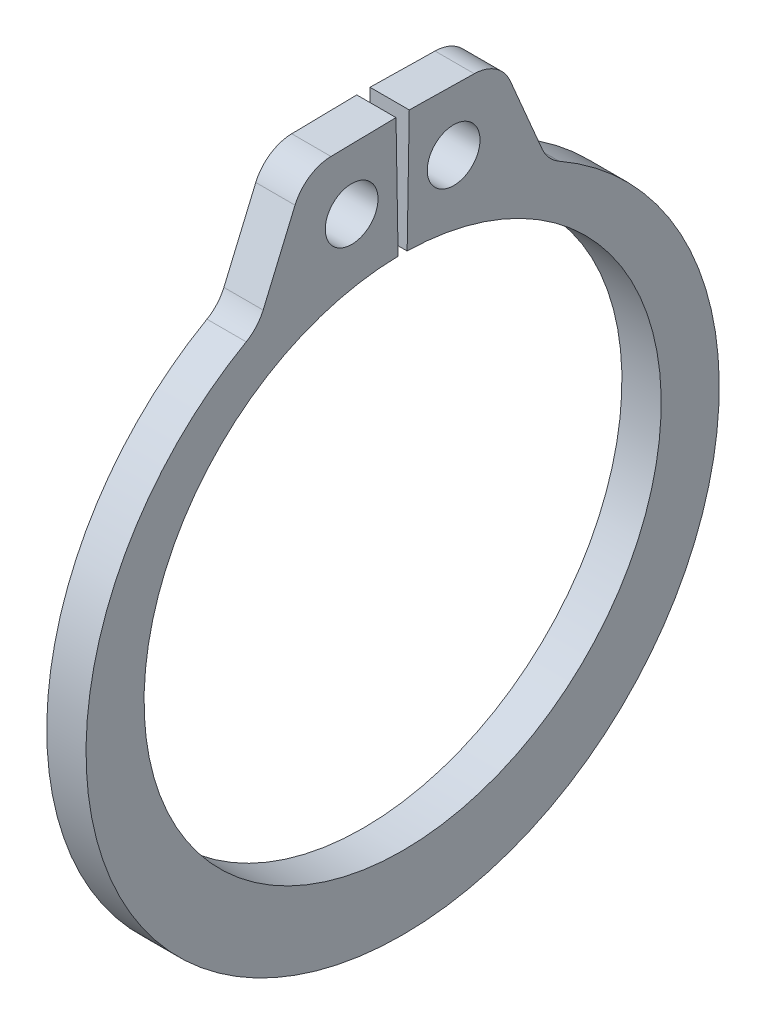
ISO-10303-21;
HEADER;
FILE_DESCRIPTION(('STEP AP214'),'2;1');
FILE_NAME('part.step','',(''),(''),'','','');
FILE_SCHEMA(('AUTOMOTIVE_DESIGN { 1 0 10303 214 1 1 1 1 }'));
ENDSEC;
DATA;
#1=APPLICATION_CONTEXT('core data for automotive mechanical design processes');
#2=APPLICATION_PROTOCOL_DEFINITION('international standard','automotive_design',2000,#1);
#3=PRODUCT_CONTEXT('',#1,'mechanical');
#4=PRODUCT('Part','Part','',(#3));
#5=PRODUCT_RELATED_PRODUCT_CATEGORY('part','',(#4));
#6=PRODUCT_DEFINITION_FORMATION('','',#4);
#7=PRODUCT_DEFINITION_CONTEXT('part definition',#1,'design');
#8=PRODUCT_DEFINITION('design','',#6,#7);
#9=PRODUCT_DEFINITION_SHAPE('','',#8);
#10=(LENGTH_UNIT() NAMED_UNIT(*) SI_UNIT(.MILLI.,.METRE.));
#11=(NAMED_UNIT(*) PLANE_ANGLE_UNIT() SI_UNIT($,.RADIAN.));
#12=(NAMED_UNIT(*) SI_UNIT($,.STERADIAN.) SOLID_ANGLE_UNIT());
#13=UNCERTAINTY_MEASURE_WITH_UNIT(LENGTH_MEASURE(1.E-05),#10,'distance_accuracy_value','');
#14=(GEOMETRIC_REPRESENTATION_CONTEXT(3) GLOBAL_UNCERTAINTY_ASSIGNED_CONTEXT((#13)) GLOBAL_UNIT_ASSIGNED_CONTEXT((#10,
#11,#12)) REPRESENTATION_CONTEXT('',''));
#15=CARTESIAN_POINT('',(0.,0.,0.));
#16=DIRECTION('',(0.,0.,1.));
#17=DIRECTION('',(1.,0.,0.));
#18=AXIS2_PLACEMENT_3D('',#15,#16,#17);
#19=CARTESIAN_POINT('',(0.4445,7.66933071962558,1.60650376158788));
#20=DIRECTION('',(-1.,0.,0.));
#21=DIRECTION('',(0.,0.,1.));
#22=AXIS2_PLACEMENT_3D('',#19,#20,#21);
#23=CYLINDRICAL_SURFACE('',#22,0.901700000000001);
#24=CARTESIAN_POINT('',(-0.4445,7.66933071962558,1.60650376158788));
#25=DIRECTION('',(-1.,0.,0.));
#26=DIRECTION('',(0.,0.,1.));
#27=AXIS2_PLACEMENT_3D('',#24,#25,#26);
#28=CIRCLE('',#27,0.901700000000001);
#29=CARTESIAN_POINT('',(-0.4445,8.02240621636442,2.43620285379096));
#30=VERTEX_POINT('',#29);
#31=CARTESIAN_POINT('',(-0.4445,8.5708933863481,1.62224059647237));
#32=VERTEX_POINT('',#31);
#33=EDGE_CURVE('E154',#30,#32,#28,.T.);
#34=ORIENTED_EDGE('',*,*,#33,.F.);
#35=DIRECTION('',(-1.,0.,0.));
#36=VECTOR('',#35,1.);
#37=CARTESIAN_POINT('',(0.4445,8.02240621636442,2.43620285379096));
#38=LINE('',#37,#36);
#39=CARTESIAN_POINT('',(0.4445,8.02240621636442,2.43620285379096));
#40=VERTEX_POINT('',#39);
#41=EDGE_CURVE('E11',#40,#30,#38,.T.);
#42=ORIENTED_EDGE('',*,*,#41,.F.);
#43=CARTESIAN_POINT('',(0.4445,7.66933071962558,1.60650376158788));
#44=DIRECTION('',(-1.,0.,0.));
#45=DIRECTION('',(0.,0.,1.));
#46=AXIS2_PLACEMENT_3D('',#43,#44,#45);
#47=CIRCLE('',#46,0.901700000000001);
#48=CARTESIAN_POINT('',(0.4445,8.5708933863481,1.62224059647237));
#49=VERTEX_POINT('',#48);
#50=EDGE_CURVE('E187',#40,#49,#47,.T.);
#51=ORIENTED_EDGE('',*,*,#50,.T.);
#52=DIRECTION('',(-1.,0.,0.));
#53=VECTOR('',#52,1.);
#54=CARTESIAN_POINT('',(0.4445,8.5708933863481,1.62224059647237));
#55=LINE('',#54,#53);
#56=EDGE_CURVE('E36',#49,#32,#55,.T.);
#57=ORIENTED_EDGE('',*,*,#56,.T.);
#58=EDGE_LOOP('',(#34,#42,#51,#57));
#59=FACE_BOUND('',#58,.T.);
#60=ADVANCED_FACE('F33',(#59),#23,.T.);
#61=CARTESIAN_POINT('',(0.4445,6.32616456625773,3.15803245301383));
#62=DIRECTION('',(0.,0.391566481910657,0.920149819455566));
#63=DIRECTION('',(0.,-0.920149819455566,0.391566481910657));
#64=AXIS2_PLACEMENT_3D('',#61,#62,#63);
#65=PLANE('',#64);
#66=DIRECTION('',(0.,0.920149819455566,-0.391566481910657));
#67=VECTOR('',#66,1.);
#68=CARTESIAN_POINT('',(-0.4445,6.32616456625773,3.15803245301383));
#69=LINE('',#68,#67);
#70=CARTESIAN_POINT('',(-0.4445,6.32616456625773,3.15803245301383));
#71=VERTEX_POINT('',#70);
#72=EDGE_CURVE('E185',#71,#30,#69,.T.);
#73=ORIENTED_EDGE('',*,*,#72,.F.);
#74=DIRECTION('',(-1.,0.,0.));
#75=VECTOR('',#74,1.);
#76=CARTESIAN_POINT('',(0.4445,6.32616456625773,3.15803245301383));
#77=LINE('',#76,#75);
#78=CARTESIAN_POINT('',(0.4445,6.32616456625773,3.15803245301383));
#79=VERTEX_POINT('',#78);
#80=EDGE_CURVE('E42',#79,#71,#77,.T.);
#81=ORIENTED_EDGE('',*,*,#80,.F.);
#82=DIRECTION('',(0.,0.920149819455566,-0.391566481910657));
#83=VECTOR('',#82,1.);
#84=CARTESIAN_POINT('',(0.4445,6.32616456625773,3.15803245301383));
#85=LINE('',#84,#83);
#86=EDGE_CURVE('E144',#79,#40,#85,.T.);
#87=ORIENTED_EDGE('',*,*,#86,.T.);
#88=ORIENTED_EDGE('',*,*,#41,.T.);
#89=EDGE_LOOP('',(#73,#81,#87,#88));
#90=FACE_BOUND('',#89,.T.);
#91=ADVANCED_FACE('F207',(#90),#65,.T.);
#92=CARTESIAN_POINT('',(0.4445,6.67924006299657,3.98773154521692));
#93=DIRECTION('',(-1.,0.,0.));
#94=DIRECTION('',(0.,0.,1.));
#95=AXIS2_PLACEMENT_3D('',#92,#93,#94);
#96=CYLINDRICAL_SURFACE('',#95,0.901700000000001);
#97=CARTESIAN_POINT('',(-0.4445,6.67924006299657,3.98773154521692));
#98=DIRECTION('',(1.,0.,0.));
#99=DIRECTION('',(0.,0.,-1.));
#100=AXIS2_PLACEMENT_3D('',#97,#98,#99);
#101=CIRCLE('',#100,0.901700000000001);
#102=CARTESIAN_POINT('',(-0.4445,5.89530863003733,3.54218199868087));
#103=VERTEX_POINT('',#102);
#104=EDGE_CURVE('E131',#103,#71,#101,.T.);
#105=ORIENTED_EDGE('',*,*,#104,.F.);
#106=DIRECTION('',(-1.,0.,0.));
#107=VECTOR('',#106,1.);
#108=CARTESIAN_POINT('',(0.4445,5.89530863003733,3.54218199868087));
#109=LINE('',#108,#107);
#110=CARTESIAN_POINT('',(0.4445,5.89530863003733,3.54218199868087));
#111=VERTEX_POINT('',#110);
#112=EDGE_CURVE('E126',#111,#103,#109,.T.);
#113=ORIENTED_EDGE('',*,*,#112,.F.);
#114=CARTESIAN_POINT('',(0.4445,6.67924006299657,3.98773154521692));
#115=DIRECTION('',(1.,0.,0.));
#116=DIRECTION('',(0.,0.,-1.));
#117=AXIS2_PLACEMENT_3D('',#114,#115,#116);
#118=CIRCLE('',#117,0.901700000000001);
#119=EDGE_CURVE('E129',#111,#79,#118,.T.);
#120=ORIENTED_EDGE('',*,*,#119,.T.);
#121=ORIENTED_EDGE('',*,*,#80,.T.);
#122=EDGE_LOOP('',(#105,#113,#120,#121));
#123=FACE_BOUND('',#122,.T.);
#124=ADVANCED_FACE('F128',(#123),#96,.F.);
#125=CARTESIAN_POINT('',(0.4445,-0.337057291142251,0.));
#126=DIRECTION('',(-1.,0.,0.));
#127=DIRECTION('',(0.,0.,1.));
#128=AXIS2_PLACEMENT_3D('',#125,#126,#127);
#129=CYLINDRICAL_SURFACE('',#128,7.16864270885775);
#130=CARTESIAN_POINT('',(-0.4445,-0.337057291142251,0.));
#131=DIRECTION('',(-1.,0.,0.));
#132=DIRECTION('',(0.,0.,1.));
#133=AXIS2_PLACEMENT_3D('',#130,#131,#132);
#134=CIRCLE('',#133,7.16864270885775);
#135=CARTESIAN_POINT('',(-0.4445,5.89530863003733,-3.54218199868087));
#136=VERTEX_POINT('',#135);
#137=EDGE_CURVE('E182',#136,#103,#134,.T.);
#138=ORIENTED_EDGE('',*,*,#137,.F.);
#139=DIRECTION('',(-1.,0.,0.));
#140=VECTOR('',#139,1.);
#141=CARTESIAN_POINT('',(0.4445,5.89530863003733,-3.54218199868087));
#142=LINE('',#141,#140);
#143=CARTESIAN_POINT('',(0.4445,5.89530863003733,-3.54218199868087));
#144=VERTEX_POINT('',#143);
#145=EDGE_CURVE('E136',#144,#136,#142,.T.);
#146=ORIENTED_EDGE('',*,*,#145,.F.);
#147=CARTESIAN_POINT('',(0.4445,-0.337057291142251,0.));
#148=DIRECTION('',(-1.,0.,0.));
#149=DIRECTION('',(0.,0.,1.));
#150=AXIS2_PLACEMENT_3D('',#147,#148,#149);
#151=CIRCLE('',#150,7.16864270885775);
#152=EDGE_CURVE('E142',#144,#111,#151,.T.);
#153=ORIENTED_EDGE('',*,*,#152,.T.);
#154=ORIENTED_EDGE('',*,*,#112,.T.);
#155=EDGE_LOOP('',(#138,#146,#153,#154));
#156=FACE_BOUND('',#155,.T.);
#157=ADVANCED_FACE('F146',(#156),#129,.T.);
#158=CARTESIAN_POINT('',(0.4445,6.67924006299657,-3.98773154521692));
#159=DIRECTION('',(-1.,0.,0.));
#160=DIRECTION('',(0.,0.,1.));
#161=AXIS2_PLACEMENT_3D('',#158,#159,#160);
#162=CYLINDRICAL_SURFACE('',#161,0.901700000000001);
#163=CARTESIAN_POINT('',(-0.4445,6.67924006299657,-3.98773154521692));
#164=DIRECTION('',(1.,0.,0.));
#165=DIRECTION('',(0.,0.,-1.));
#166=AXIS2_PLACEMENT_3D('',#163,#164,#165);
#167=CIRCLE('',#166,0.901700000000001);
#168=CARTESIAN_POINT('',(-0.4445,6.32616456625773,-3.15803245301383));
#169=VERTEX_POINT('',#168);
#170=EDGE_CURVE('E179',#169,#136,#167,.T.);
#171=ORIENTED_EDGE('',*,*,#170,.F.);
#172=DIRECTION('',(-1.,0.,0.));
#173=VECTOR('',#172,1.);
#174=CARTESIAN_POINT('',(0.4445,6.32616456625773,-3.15803245301383));
#175=LINE('',#174,#173);
#176=CARTESIAN_POINT('',(0.4445,6.32616456625773,-3.15803245301383));
#177=VERTEX_POINT('',#176);
#178=EDGE_CURVE('E191',#177,#169,#175,.T.);
#179=ORIENTED_EDGE('',*,*,#178,.F.);
#180=CARTESIAN_POINT('',(0.4445,6.67924006299657,-3.98773154521692));
#181=DIRECTION('',(1.,0.,0.));
#182=DIRECTION('',(0.,0.,-1.));
#183=AXIS2_PLACEMENT_3D('',#180,#181,#182);
#184=CIRCLE('',#183,0.901700000000001);
#185=EDGE_CURVE('E147',#177,#144,#184,.T.);
#186=ORIENTED_EDGE('',*,*,#185,.T.);
#187=ORIENTED_EDGE('',*,*,#145,.T.);
#188=EDGE_LOOP('',(#171,#179,#186,#187));
#189=FACE_BOUND('',#188,.T.);
#190=ADVANCED_FACE('F220',(#189),#162,.F.);
#191=CARTESIAN_POINT('',(0.4445,8.02240621636442,-2.43620285379096));
#192=DIRECTION('',(0.,0.391566481910657,-0.920149819455566));
#193=DIRECTION('',(0.,0.920149819455566,0.391566481910657));
#194=AXIS2_PLACEMENT_3D('',#191,#192,#193);
#195=PLANE('',#194);
#196=DIRECTION('',(0.,-0.920149819455566,-0.391566481910657));
#197=VECTOR('',#196,1.);
#198=CARTESIAN_POINT('',(-0.4445,8.02240621636442,-2.43620285379096));
#199=LINE('',#198,#197);
#200=CARTESIAN_POINT('',(-0.4445,8.02240621636442,-2.43620285379096));
#201=VERTEX_POINT('',#200);
#202=EDGE_CURVE('E176',#201,#169,#199,.T.);
#203=ORIENTED_EDGE('',*,*,#202,.F.);
#204=DIRECTION('',(-1.,0.,0.));
#205=VECTOR('',#204,1.);
#206=CARTESIAN_POINT('',(0.4445,8.02240621636442,-2.43620285379096));
#207=LINE('',#206,#205);
#208=CARTESIAN_POINT('',(0.4445,8.02240621636442,-2.43620285379096));
#209=VERTEX_POINT('',#208);
#210=EDGE_CURVE('E193',#209,#201,#207,.T.);
#211=ORIENTED_EDGE('',*,*,#210,.F.);
#212=DIRECTION('',(0.,-0.920149819455566,-0.391566481910657));
#213=VECTOR('',#212,1.);
#214=CARTESIAN_POINT('',(0.4445,8.02240621636442,-2.43620285379096));
#215=LINE('',#214,#213);
#216=EDGE_CURVE('E149',#209,#177,#215,.T.);
#217=ORIENTED_EDGE('',*,*,#216,.T.);
#218=ORIENTED_EDGE('',*,*,#178,.T.);
#219=EDGE_LOOP('',(#203,#211,#217,#218));
#220=FACE_BOUND('',#219,.T.);
#221=ADVANCED_FACE('F223',(#220),#195,.T.);
#222=CARTESIAN_POINT('',(0.4445,7.66933071962558,-1.60650376158788));
#223=DIRECTION('',(-1.,0.,0.));
#224=DIRECTION('',(0.,0.,1.));
#225=AXIS2_PLACEMENT_3D('',#222,#223,#224);
#226=CYLINDRICAL_SURFACE('',#225,0.901700000000001);
#227=CARTESIAN_POINT('',(-0.4445,7.66933071962558,-1.60650376158788));
#228=DIRECTION('',(-1.,0.,0.));
#229=DIRECTION('',(0.,0.,1.));
#230=AXIS2_PLACEMENT_3D('',#227,#228,#229);
#231=CIRCLE('',#230,0.901700000000001);
#232=CARTESIAN_POINT('',(-0.4445,8.5708933863481,-1.62224059647238));
#233=VERTEX_POINT('',#232);
#234=EDGE_CURVE('E173',#233,#201,#231,.T.);
#235=ORIENTED_EDGE('',*,*,#234,.F.);
#236=DIRECTION('',(-1.,0.,0.));
#237=VECTOR('',#236,1.);
#238=CARTESIAN_POINT('',(0.4445,8.5708933863481,-1.62224059647238));
#239=LINE('',#238,#237);
#240=CARTESIAN_POINT('',(0.4445,8.5708933863481,-1.62224059647238));
#241=VERTEX_POINT('',#240);
#242=EDGE_CURVE('E195',#241,#233,#239,.T.);
#243=ORIENTED_EDGE('',*,*,#242,.F.);
#244=CARTESIAN_POINT('',(0.4445,7.66933071962558,-1.60650376158788));
#245=DIRECTION('',(-1.,0.,0.));
#246=DIRECTION('',(0.,0.,1.));
#247=AXIS2_PLACEMENT_3D('',#244,#245,#246);
#248=CIRCLE('',#247,0.901700000000001);
#249=EDGE_CURVE('E297',#241,#209,#248,.T.);
#250=ORIENTED_EDGE('',*,*,#249,.T.);
#251=ORIENTED_EDGE('',*,*,#210,.T.);
#252=EDGE_LOOP('',(#235,#243,#250,#251));
#253=FACE_BOUND('',#252,.T.);
#254=ADVANCED_FACE('F227',(#253),#226,.T.);
#255=CARTESIAN_POINT('',(0.4445,8.59659049818515,-0.15005404530712));
#256=DIRECTION('',(0.,0.999847695156391,-0.0174524064372901));
#257=DIRECTION('',(0.,0.0174524064372902,0.999847695156391));
#258=AXIS2_PLACEMENT_3D('',#255,#256,#257);
#259=PLANE('',#258);
#260=DIRECTION('',(0.,-0.0174524064372901,-0.999847695156391));
#261=VECTOR('',#260,1.);
#262=CARTESIAN_POINT('',(-0.4445,8.59659049818515,-0.15005404530712));
#263=LINE('',#262,#261);
#264=CARTESIAN_POINT('',(-0.4445,8.59659049818515,-0.15005404530712));
#265=VERTEX_POINT('',#264);
#266=EDGE_CURVE('E170',#265,#233,#263,.T.);
#267=ORIENTED_EDGE('',*,*,#266,.F.);
#268=DIRECTION('',(-1.,0.,0.));
#269=VECTOR('',#268,1.);
#270=CARTESIAN_POINT('',(0.4445,8.59659049818515,-0.15005404530712));
#271=LINE('',#270,#269);
#272=CARTESIAN_POINT('',(0.4445,8.59659049818515,-0.15005404530712));
#273=VERTEX_POINT('',#272);
#274=EDGE_CURVE('E197',#273,#265,#271,.T.);
#275=ORIENTED_EDGE('',*,*,#274,.F.);
#276=DIRECTION('',(0.,-0.0174524064372901,-0.999847695156391));
#277=VECTOR('',#276,1.);
#278=CARTESIAN_POINT('',(0.4445,8.59659049818515,-0.15005404530712));
#279=LINE('',#278,#277);
#280=EDGE_CURVE('E294',#273,#241,#279,.T.);
#281=ORIENTED_EDGE('',*,*,#280,.T.);
#282=ORIENTED_EDGE('',*,*,#242,.T.);
#283=EDGE_LOOP('',(#267,#275,#281,#282));
#284=FACE_BOUND('',#283,.T.);
#285=ADVANCED_FACE('F231',(#284),#259,.T.);
#286=CARTESIAN_POINT('',(0.4445,5.85380830083213,-0.102178603968346));
#287=DIRECTION('',(0.,0.0174524064372902,0.999847695156391));
#288=DIRECTION('',(0.,-0.999847695156391,0.0174524064372902));
#289=AXIS2_PLACEMENT_3D('',#286,#287,#288);
#290=PLANE('',#289);
#291=DIRECTION('',(0.,0.999847695156391,-0.0174524064372902));
#292=VECTOR('',#291,1.);
#293=CARTESIAN_POINT('',(-0.4445,5.85380830083213,-0.102178603968346));
#294=LINE('',#293,#292);
#295=CARTESIAN_POINT('',(-0.4445,5.85380830083213,-0.102178603968346));
#296=VERTEX_POINT('',#295);
#297=EDGE_CURVE('E167',#296,#265,#294,.T.);
#298=ORIENTED_EDGE('',*,*,#297,.F.);
#299=DIRECTION('',(-1.,0.,0.));
#300=VECTOR('',#299,1.);
#301=CARTESIAN_POINT('',(0.4445,5.85380830083213,-0.102178603968346));
#302=LINE('',#301,#300);
#303=CARTESIAN_POINT('',(0.4445,5.85380830083213,-0.102178603968346));
#304=VERTEX_POINT('',#303);
#305=EDGE_CURVE('E199',#304,#296,#302,.T.);
#306=ORIENTED_EDGE('',*,*,#305,.F.);
#307=DIRECTION('',(0.,0.999847695156391,-0.0174524064372902));
#308=VECTOR('',#307,1.);
#309=CARTESIAN_POINT('',(0.4445,5.85380830083213,-0.102178603968346));
#310=LINE('',#309,#308);
#311=EDGE_CURVE('E291',#304,#273,#310,.T.);
#312=ORIENTED_EDGE('',*,*,#311,.T.);
#313=ORIENTED_EDGE('',*,*,#274,.T.);
#314=EDGE_LOOP('',(#298,#306,#312,#313));
#315=FACE_BOUND('',#314,.T.);
#316=ADVANCED_FACE('F235',(#315),#290,.T.);
#317=CARTESIAN_POINT('',(0.4445,0.,0.));
#318=DIRECTION('',(-1.,0.,0.));
#319=DIRECTION('',(0.,0.,1.));
#320=AXIS2_PLACEMENT_3D('',#317,#318,#319);
#321=CYLINDRICAL_SURFACE('',#320,5.8547);
#322=CARTESIAN_POINT('',(-0.4445,0.,0.));
#323=DIRECTION('',(1.,0.,0.));
#324=DIRECTION('',(0.,0.,-1.));
#325=AXIS2_PLACEMENT_3D('',#322,#323,#324);
#326=CIRCLE('',#325,5.8547);
#327=CARTESIAN_POINT('',(-0.4445,5.85380830083213,0.102178603968379));
#328=VERTEX_POINT('',#327);
#329=EDGE_CURVE('E164',#328,#296,#326,.T.);
#330=ORIENTED_EDGE('',*,*,#329,.F.);
#331=DIRECTION('',(-1.,0.,0.));
#332=VECTOR('',#331,1.);
#333=CARTESIAN_POINT('',(0.4445,5.85380830083213,0.102178603968379));
#334=LINE('',#333,#332);
#335=CARTESIAN_POINT('',(0.4445,5.85380830083213,0.102178603968379));
#336=VERTEX_POINT('',#335);
#337=EDGE_CURVE('E201',#336,#328,#334,.T.);
#338=ORIENTED_EDGE('',*,*,#337,.F.);
#339=CARTESIAN_POINT('',(0.4445,0.,0.));
#340=DIRECTION('',(1.,0.,0.));
#341=DIRECTION('',(0.,0.,-1.));
#342=AXIS2_PLACEMENT_3D('',#339,#340,#341);
#343=CIRCLE('',#342,5.8547);
#344=EDGE_CURVE('E288',#336,#304,#343,.T.);
#345=ORIENTED_EDGE('',*,*,#344,.T.);
#346=ORIENTED_EDGE('',*,*,#305,.T.);
#347=EDGE_LOOP('',(#330,#338,#345,#346));
#348=FACE_BOUND('',#347,.T.);
#349=ADVANCED_FACE('F239',(#348),#321,.F.);
#350=CARTESIAN_POINT('',(0.4445,8.59659049818513,0.150054045307115));
#351=DIRECTION('',(0.,0.0174524064372763,-0.999847695156391));
#352=DIRECTION('',(0.,0.999847695156391,0.0174524064372763));
#353=AXIS2_PLACEMENT_3D('',#350,#351,#352);
#354=PLANE('',#353);
#355=DIRECTION('',(0.,-0.999847695156391,-0.0174524064372763));
#356=VECTOR('',#355,1.);
#357=CARTESIAN_POINT('',(-0.4445,8.59659049818513,0.150054045307115));
#358=LINE('',#357,#356);
#359=CARTESIAN_POINT('',(-0.4445,8.59659049818513,0.150054045307115));
#360=VERTEX_POINT('',#359);
#361=EDGE_CURVE('E161',#360,#328,#358,.T.);
#362=ORIENTED_EDGE('',*,*,#361,.F.);
#363=DIRECTION('',(-1.,0.,0.));
#364=VECTOR('',#363,1.);
#365=CARTESIAN_POINT('',(0.4445,8.59659049818513,0.150054045307115));
#366=LINE('',#365,#364);
#367=CARTESIAN_POINT('',(0.4445,8.59659049818513,0.150054045307115));
#368=VERTEX_POINT('',#367);
#369=EDGE_CURVE('E202',#368,#360,#366,.T.);
#370=ORIENTED_EDGE('',*,*,#369,.F.);
#371=DIRECTION('',(0.,-0.999847695156391,-0.0174524064372763));
#372=VECTOR('',#371,1.);
#373=CARTESIAN_POINT('',(0.4445,8.59659049818513,0.150054045307115));
#374=LINE('',#373,#372);
#375=EDGE_CURVE('E285',#368,#336,#374,.T.);
#376=ORIENTED_EDGE('',*,*,#375,.T.);
#377=ORIENTED_EDGE('',*,*,#337,.T.);
#378=EDGE_LOOP('',(#362,#370,#376,#377));
#379=FACE_BOUND('',#378,.T.);
#380=ADVANCED_FACE('F243',(#379),#354,.T.);
#381=CARTESIAN_POINT('',(0.4445,8.5708933863481,1.62224059647237));
#382=DIRECTION('',(0.,0.999847695156391,0.0174524064372761));
#383=DIRECTION('',(0.,-0.0174524064372761,0.999847695156391));
#384=AXIS2_PLACEMENT_3D('',#381,#382,#383);
#385=PLANE('',#384);
#386=DIRECTION('',(0.,0.0174524064372761,-0.999847695156391));
#387=VECTOR('',#386,1.);
#388=CARTESIAN_POINT('',(-0.4445,8.5708933863481,1.62224059647237));
#389=LINE('',#388,#387);
#390=EDGE_CURVE('E157',#32,#360,#389,.T.);
#391=ORIENTED_EDGE('',*,*,#390,.F.);
#392=ORIENTED_EDGE('',*,*,#56,.F.);
#393=DIRECTION('',(0.,0.0174524064372761,-0.999847695156391));
#394=VECTOR('',#393,1.);
#395=CARTESIAN_POINT('',(0.4445,8.5708933863481,1.62224059647237));
#396=LINE('',#395,#394);
#397=EDGE_CURVE('E283',#49,#368,#396,.T.);
#398=ORIENTED_EDGE('',*,*,#397,.T.);
#399=ORIENTED_EDGE('',*,*,#369,.T.);
#400=EDGE_LOOP('',(#391,#392,#398,#399));
#401=FACE_BOUND('',#400,.T.);
#402=ADVANCED_FACE('F204',(#401),#385,.T.);
#403=CARTESIAN_POINT('',(0.4445,7.66933071962558,1.60650376158788));
#404=DIRECTION('',(-1.,0.,0.));
#405=DIRECTION('',(0.,0.,1.));
#406=AXIS2_PLACEMENT_3D('',#403,#404,#405);
#407=PLANE('',#406);
#408=CARTESIAN_POINT('',(0.4445,7.20724610900658,1.15465964864512));
#409=DIRECTION('',(-1.,0.,0.));
#410=DIRECTION('',(0.,0.,-1.));
#411=AXIS2_PLACEMENT_3D('',#408,#409,#410);
#412=CIRCLE('',#411,0.5969);
#413=CARTESIAN_POINT('',(0.4445,7.20724610900658,0.557759648645124));
#414=VERTEX_POINT('',#413);
#415=EDGE_CURVE('E270',#414,#414,#412,.T.);
#416=ORIENTED_EDGE('',*,*,#415,.T.);
#417=EDGE_LOOP('',(#416));
#418=FACE_BOUND('',#417,.T.);
#419=CARTESIAN_POINT('',(0.4445,7.20724610900658,-1.15465964864512));
#420=DIRECTION('',(-1.,0.,0.));
#421=DIRECTION('',(0.,0.,-1.));
#422=AXIS2_PLACEMENT_3D('',#419,#420,#421);
#423=CIRCLE('',#422,0.5969);
#424=CARTESIAN_POINT('',(0.4445,7.20724610900658,-1.75155964864512));
#425=VERTEX_POINT('',#424);
#426=EDGE_CURVE('E158',#425,#425,#423,.T.);
#427=ORIENTED_EDGE('',*,*,#426,.T.);
#428=EDGE_LOOP('',(#427));
#429=FACE_BOUND('',#428,.T.);
#430=ORIENTED_EDGE('',*,*,#50,.F.);
#431=ORIENTED_EDGE('',*,*,#86,.F.);
#432=ORIENTED_EDGE('',*,*,#119,.F.);
#433=ORIENTED_EDGE('',*,*,#152,.F.);
#434=ORIENTED_EDGE('',*,*,#185,.F.);
#435=ORIENTED_EDGE('',*,*,#216,.F.);
#436=ORIENTED_EDGE('',*,*,#249,.F.);
#437=ORIENTED_EDGE('',*,*,#280,.F.);
#438=ORIENTED_EDGE('',*,*,#311,.F.);
#439=ORIENTED_EDGE('',*,*,#344,.F.);
#440=ORIENTED_EDGE('',*,*,#375,.F.);
#441=ORIENTED_EDGE('',*,*,#397,.F.);
#442=EDGE_LOOP('',(#430,#431,#432,#433,#434,#435,#436,#437,#438,#439,#440,#441));
#443=FACE_BOUND('',#442,.T.);
#444=ADVANCED_FACE('F140',(#418,#429,#443),#407,.F.);
#445=CARTESIAN_POINT('',(-0.4445,7.66933071962558,1.60650376158788));
#446=DIRECTION('',(-1.,0.,0.));
#447=DIRECTION('',(0.,0.,1.));
#448=AXIS2_PLACEMENT_3D('',#445,#446,#447);
#449=PLANE('',#448);
#450=CARTESIAN_POINT('',(-0.4445,7.20724610900658,1.15465964864512));
#451=DIRECTION('',(-1.,0.,0.));
#452=DIRECTION('',(0.,0.,-1.));
#453=AXIS2_PLACEMENT_3D('',#450,#451,#452);
#454=CIRCLE('',#453,0.5969);
#455=CARTESIAN_POINT('',(-0.4445,7.20724610900658,0.557759648645124));
#456=VERTEX_POINT('',#455);
#457=EDGE_CURVE('E273',#456,#456,#454,.T.);
#458=ORIENTED_EDGE('',*,*,#457,.F.);
#459=EDGE_LOOP('',(#458));
#460=FACE_BOUND('',#459,.T.);
#461=CARTESIAN_POINT('',(-0.4445,7.20724610900658,-1.15465964864512));
#462=DIRECTION('',(-1.,0.,0.));
#463=DIRECTION('',(0.,0.,-1.));
#464=AXIS2_PLACEMENT_3D('',#461,#462,#463);
#465=CIRCLE('',#464,0.5969);
#466=CARTESIAN_POINT('',(-0.4445,7.20724610900658,-1.75155964864512));
#467=VERTEX_POINT('',#466);
#468=EDGE_CURVE('E275',#467,#467,#465,.T.);
#469=ORIENTED_EDGE('',*,*,#468,.F.);
#470=EDGE_LOOP('',(#469));
#471=FACE_BOUND('',#470,.T.);
#472=ORIENTED_EDGE('',*,*,#33,.T.);
#473=ORIENTED_EDGE('',*,*,#390,.T.);
#474=ORIENTED_EDGE('',*,*,#361,.T.);
#475=ORIENTED_EDGE('',*,*,#329,.T.);
#476=ORIENTED_EDGE('',*,*,#297,.T.);
#477=ORIENTED_EDGE('',*,*,#266,.T.);
#478=ORIENTED_EDGE('',*,*,#234,.T.);
#479=ORIENTED_EDGE('',*,*,#202,.T.);
#480=ORIENTED_EDGE('',*,*,#170,.T.);
#481=ORIENTED_EDGE('',*,*,#137,.T.);
#482=ORIENTED_EDGE('',*,*,#104,.T.);
#483=ORIENTED_EDGE('',*,*,#72,.T.);
#484=EDGE_LOOP('',(#472,#473,#474,#475,#476,#477,#478,#479,#480,#481,#482,#483));
#485=FACE_BOUND('',#484,.T.);
#486=ADVANCED_FACE('F206',(#460,#471,#485),#449,.T.);
#487=CARTESIAN_POINT('',(0.4445,7.20724610900658,-1.15465964864512));
#488=DIRECTION('',(-1.,0.,0.));
#489=DIRECTION('',(0.,0.,1.));
#490=AXIS2_PLACEMENT_3D('',#487,#488,#489);
#491=CYLINDRICAL_SURFACE('',#490,0.5969);
#492=ORIENTED_EDGE('',*,*,#426,.F.);
#493=EDGE_LOOP('',(#492));
#494=FACE_BOUND('',#493,.T.);
#495=ORIENTED_EDGE('',*,*,#468,.T.);
#496=EDGE_LOOP('',(#495));
#497=FACE_BOUND('',#496,.T.);
#498=ADVANCED_FACE('F255',(#494,#497),#491,.F.);
#499=CARTESIAN_POINT('',(0.4445,7.20724610900658,1.15465964864512));
#500=DIRECTION('',(-1.,0.,0.));
#501=DIRECTION('',(0.,0.,1.));
#502=AXIS2_PLACEMENT_3D('',#499,#500,#501);
#503=CYLINDRICAL_SURFACE('',#502,0.5969);
#504=ORIENTED_EDGE('',*,*,#415,.F.);
#505=EDGE_LOOP('',(#504));
#506=FACE_BOUND('',#505,.T.);
#507=ORIENTED_EDGE('',*,*,#457,.T.);
#508=EDGE_LOOP('',(#507));
#509=FACE_BOUND('',#508,.T.);
#510=ADVANCED_FACE('F262',(#506,#509),#503,.F.);
#511=CLOSED_SHELL('',(#60,#91,#124,#157,#190,#221,#254,#285,#316,#349,#380,#402,#444,#486,#498,#510));
#512=MANIFOLD_SOLID_BREP('B2',#511);
#513=ADVANCED_BREP_SHAPE_REPRESENTATION('',(#18,#512),#14);
#514=SHAPE_DEFINITION_REPRESENTATION(#9,#513);
ENDSEC;
END-ISO-10303-21;
